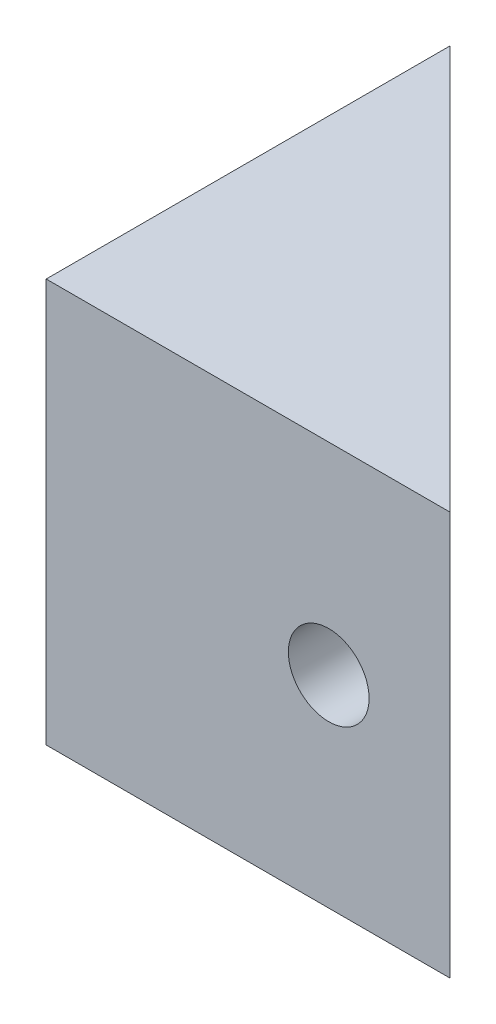
ISO-10303-21;
HEADER;
FILE_DESCRIPTION(('STEP AP214'),'2;1');
FILE_NAME('part.step','',(''),(''),'','','');
FILE_SCHEMA(('AUTOMOTIVE_DESIGN { 1 0 10303 214 1 1 1 1 }'));
ENDSEC;
DATA;
#1=APPLICATION_CONTEXT('core data for automotive mechanical design processes');
#2=APPLICATION_PROTOCOL_DEFINITION('international standard','automotive_design',2000,#1);
#3=PRODUCT_CONTEXT('',#1,'mechanical');
#4=PRODUCT('Part','Part','',(#3));
#5=PRODUCT_RELATED_PRODUCT_CATEGORY('part','',(#4));
#6=PRODUCT_DEFINITION_FORMATION('','',#4);
#7=PRODUCT_DEFINITION_CONTEXT('part definition',#1,'design');
#8=PRODUCT_DEFINITION('design','',#6,#7);
#9=PRODUCT_DEFINITION_SHAPE('','',#8);
#10=(LENGTH_UNIT() NAMED_UNIT(*) SI_UNIT(.MILLI.,.METRE.));
#11=(NAMED_UNIT(*) PLANE_ANGLE_UNIT() SI_UNIT($,.RADIAN.));
#12=(NAMED_UNIT(*) SI_UNIT($,.STERADIAN.) SOLID_ANGLE_UNIT());
#13=UNCERTAINTY_MEASURE_WITH_UNIT(LENGTH_MEASURE(1.E-05),#10,'distance_accuracy_value','');
#14=(GEOMETRIC_REPRESENTATION_CONTEXT(3) GLOBAL_UNCERTAINTY_ASSIGNED_CONTEXT((#13)) GLOBAL_UNIT_ASSIGNED_CONTEXT((#10,
#11,#12)) REPRESENTATION_CONTEXT('',''));
#15=CARTESIAN_POINT('',(0.,0.,0.));
#16=DIRECTION('',(0.,0.,1.));
#17=DIRECTION('',(1.,0.,0.));
#18=AXIS2_PLACEMENT_3D('',#15,#16,#17);
#19=CARTESIAN_POINT('',(20.,20.,0.));
#20=DIRECTION('',(-0.707106781186548,0.,0.707106781186548));
#21=DIRECTION('',(0.707106781186548,0.,0.707106781186548));
#22=AXIS2_PLACEMENT_3D('',#19,#20,#21);
#23=PLANE('',#22);
#24=CARTESIAN_POINT('',(6.,10.,-14.));
#25=DIRECTION('',(-0.707106781186548,0.,0.707106781186548));
#26=DIRECTION('',(-0.707106781186548,0.,-0.707106781186548));
#27=AXIS2_PLACEMENT_3D('',#24,#25,#26);
#28=ELLIPSE('',#27,2.8284271247462,2.00000000000001);
#29=CARTESIAN_POINT('',(4.,10.,-16.));
#30=VERTEX_POINT('',#29);
#31=EDGE_CURVE('E130',#30,#30,#28,.F.);
#32=ORIENTED_EDGE('',*,*,#31,.F.);
#33=EDGE_LOOP('',(#32));
#34=FACE_BOUND('',#33,.T.);
#35=CARTESIAN_POINT('',(14.,10.,-6.));
#36=DIRECTION('',(-0.707106781186548,0.,0.707106781186548));
#37=DIRECTION('',(0.707106781186548,0.,0.707106781186548));
#38=AXIS2_PLACEMENT_3D('',#35,#36,#37);
#39=ELLIPSE('',#38,2.8284271247462,2.00000000000001);
#40=CARTESIAN_POINT('',(16.,10.,-3.99999999999999));
#41=VERTEX_POINT('',#40);
#42=EDGE_CURVE('E93',#41,#41,#39,.T.);
#43=ORIENTED_EDGE('',*,*,#42,.T.);
#44=EDGE_LOOP('',(#43));
#45=FACE_BOUND('',#44,.T.);
#46=DIRECTION('',(-0.707106781186548,0.,-0.707106781186548));
#47=VECTOR('',#46,1.);
#48=CARTESIAN_POINT('',(20.,0.,0.));
#49=LINE('',#48,#47);
#50=CARTESIAN_POINT('',(20.,0.,0.));
#51=VERTEX_POINT('',#50);
#52=CARTESIAN_POINT('',(0.,0.,-20.));
#53=VERTEX_POINT('',#52);
#54=EDGE_CURVE('E89',#51,#53,#49,.T.);
#55=ORIENTED_EDGE('',*,*,#54,.T.);
#56=DIRECTION('',(0.,-1.,0.));
#57=VECTOR('',#56,1.);
#58=CARTESIAN_POINT('',(0.,20.,-20.));
#59=LINE('',#58,#57);
#60=CARTESIAN_POINT('',(0.,20.,-20.));
#61=VERTEX_POINT('',#60);
#62=EDGE_CURVE('E11',#61,#53,#59,.T.);
#63=ORIENTED_EDGE('',*,*,#62,.F.);
#64=DIRECTION('',(-0.707106781186548,0.,-0.707106781186548));
#65=VECTOR('',#64,1.);
#66=CARTESIAN_POINT('',(20.,20.,0.));
#67=LINE('',#66,#65);
#68=CARTESIAN_POINT('',(20.,20.,0.));
#69=VERTEX_POINT('',#68);
#70=EDGE_CURVE('E81',#69,#61,#67,.T.);
#71=ORIENTED_EDGE('',*,*,#70,.F.);
#72=DIRECTION('',(0.,-1.,0.));
#73=VECTOR('',#72,1.);
#74=CARTESIAN_POINT('',(20.,20.,0.));
#75=LINE('',#74,#73);
#76=EDGE_CURVE('E90',#69,#51,#75,.T.);
#77=ORIENTED_EDGE('',*,*,#76,.T.);
#78=EDGE_LOOP('',(#55,#63,#71,#77));
#79=FACE_BOUND('',#78,.T.);
#80=ADVANCED_FACE('F39',(#34,#45,#79),#23,.F.);
#81=CARTESIAN_POINT('',(0.,20.,-20.));
#82=DIRECTION('',(1.,0.,0.));
#83=DIRECTION('',(0.,0.,-1.));
#84=AXIS2_PLACEMENT_3D('',#81,#82,#83);
#85=PLANE('',#84);
#86=CARTESIAN_POINT('',(0.,10.,-14.));
#87=DIRECTION('',(1.,0.,0.));
#88=DIRECTION('',(0.,0.,-1.));
#89=AXIS2_PLACEMENT_3D('',#86,#87,#88);
#90=CIRCLE('',#89,2.00000000000001);
#91=CARTESIAN_POINT('',(0.,10.,-16.));
#92=VERTEX_POINT('',#91);
#93=EDGE_CURVE('E135',#92,#92,#90,.T.);
#94=ORIENTED_EDGE('',*,*,#93,.T.);
#95=EDGE_LOOP('',(#94));
#96=FACE_BOUND('',#95,.T.);
#97=DIRECTION('',(0.,0.,1.));
#98=VECTOR('',#97,1.);
#99=CARTESIAN_POINT('',(0.,0.,-20.));
#100=LINE('',#99,#98);
#101=CARTESIAN_POINT('',(0.,0.,0.));
#102=VERTEX_POINT('',#101);
#103=EDGE_CURVE('E68',#53,#102,#100,.T.);
#104=ORIENTED_EDGE('',*,*,#103,.T.);
#105=DIRECTION('',(0.,-1.,0.));
#106=VECTOR('',#105,1.);
#107=CARTESIAN_POINT('',(0.,20.,0.));
#108=LINE('',#107,#106);
#109=CARTESIAN_POINT('',(0.,20.,0.));
#110=VERTEX_POINT('',#109);
#111=EDGE_CURVE('E48',#110,#102,#108,.T.);
#112=ORIENTED_EDGE('',*,*,#111,.F.);
#113=DIRECTION('',(0.,0.,1.));
#114=VECTOR('',#113,1.);
#115=CARTESIAN_POINT('',(0.,20.,-20.));
#116=LINE('',#115,#114);
#117=EDGE_CURVE('E76',#61,#110,#116,.T.);
#118=ORIENTED_EDGE('',*,*,#117,.F.);
#119=ORIENTED_EDGE('',*,*,#62,.T.);
#120=EDGE_LOOP('',(#104,#112,#118,#119));
#121=FACE_BOUND('',#120,.T.);
#122=ADVANCED_FACE('F77',(#96,#121),#85,.F.);
#123=CARTESIAN_POINT('',(0.,20.,0.));
#124=DIRECTION('',(0.,0.,-1.));
#125=DIRECTION('',(-1.,0.,0.));
#126=AXIS2_PLACEMENT_3D('',#123,#124,#125);
#127=PLANE('',#126);
#128=CARTESIAN_POINT('',(14.,10.,0.));
#129=DIRECTION('',(0.,0.,1.));
#130=DIRECTION('',(1.,0.,0.));
#131=AXIS2_PLACEMENT_3D('',#128,#129,#130);
#132=CIRCLE('',#131,2.00000000000001);
#133=CARTESIAN_POINT('',(16.,10.,0.));
#134=VERTEX_POINT('',#133);
#135=EDGE_CURVE('E99',#134,#134,#132,.T.);
#136=ORIENTED_EDGE('',*,*,#135,.F.);
#137=EDGE_LOOP('',(#136));
#138=FACE_BOUND('',#137,.T.);
#139=DIRECTION('',(1.,0.,0.));
#140=VECTOR('',#139,1.);
#141=CARTESIAN_POINT('',(0.,0.,0.));
#142=LINE('',#141,#140);
#143=EDGE_CURVE('E73',#102,#51,#142,.T.);
#144=ORIENTED_EDGE('',*,*,#143,.T.);
#145=ORIENTED_EDGE('',*,*,#76,.F.);
#146=DIRECTION('',(1.,0.,0.));
#147=VECTOR('',#146,1.);
#148=CARTESIAN_POINT('',(0.,20.,0.));
#149=LINE('',#148,#147);
#150=EDGE_CURVE('E56',#110,#69,#149,.T.);
#151=ORIENTED_EDGE('',*,*,#150,.F.);
#152=ORIENTED_EDGE('',*,*,#111,.T.);
#153=EDGE_LOOP('',(#144,#145,#151,#152));
#154=FACE_BOUND('',#153,.T.);
#155=ADVANCED_FACE('F107',(#138,#154),#127,.F.);
#156=CARTESIAN_POINT('',(0.,20.,0.));
#157=DIRECTION('',(0.,1.,0.));
#158=DIRECTION('',(0.,0.,1.));
#159=AXIS2_PLACEMENT_3D('',#156,#157,#158);
#160=PLANE('',#159);
#161=ORIENTED_EDGE('',*,*,#70,.T.);
#162=ORIENTED_EDGE('',*,*,#117,.T.);
#163=ORIENTED_EDGE('',*,*,#150,.T.);
#164=EDGE_LOOP('',(#161,#162,#163));
#165=FACE_BOUND('',#164,.T.);
#166=ADVANCED_FACE('F84',(#165),#160,.T.);
#167=CARTESIAN_POINT('',(0.,0.,0.));
#168=DIRECTION('',(0.,1.,0.));
#169=DIRECTION('',(0.,0.,1.));
#170=AXIS2_PLACEMENT_3D('',#167,#168,#169);
#171=PLANE('',#170);
#172=ORIENTED_EDGE('',*,*,#54,.F.);
#173=ORIENTED_EDGE('',*,*,#143,.F.);
#174=ORIENTED_EDGE('',*,*,#103,.F.);
#175=EDGE_LOOP('',(#172,#173,#174));
#176=FACE_BOUND('',#175,.T.);
#177=ADVANCED_FACE('F108',(#176),#171,.F.);
#178=CARTESIAN_POINT('',(14.,10.,-20.));
#179=DIRECTION('',(0.,0.,1.));
#180=DIRECTION('',(1.,0.,0.));
#181=AXIS2_PLACEMENT_3D('',#178,#179,#180);
#182=CYLINDRICAL_SURFACE('',#181,2.00000000000001);
#183=ORIENTED_EDGE('',*,*,#135,.T.);
#184=EDGE_LOOP('',(#183));
#185=FACE_BOUND('',#184,.T.);
#186=ORIENTED_EDGE('',*,*,#42,.F.);
#187=EDGE_LOOP('',(#186));
#188=FACE_BOUND('',#187,.T.);
#189=ADVANCED_FACE('F110',(#185,#188),#182,.F.);
#190=CARTESIAN_POINT('',(20.,10.,-14.));
#191=DIRECTION('',(-1.,0.,0.));
#192=DIRECTION('',(0.,0.,1.));
#193=AXIS2_PLACEMENT_3D('',#190,#191,#192);
#194=CYLINDRICAL_SURFACE('',#193,2.00000000000001);
#195=ORIENTED_EDGE('',*,*,#93,.F.);
#196=EDGE_LOOP('',(#195));
#197=FACE_BOUND('',#196,.T.);
#198=ORIENTED_EDGE('',*,*,#31,.T.);
#199=EDGE_LOOP('',(#198));
#200=FACE_BOUND('',#199,.T.);
#201=ADVANCED_FACE('F116',(#197,#200),#194,.F.);
#202=CLOSED_SHELL('',(#80,#122,#155,#166,#177,#189,#201));
#203=MANIFOLD_SOLID_BREP('B2',#202);
#204=ADVANCED_BREP_SHAPE_REPRESENTATION('',(#18,#203),#14);
#205=SHAPE_DEFINITION_REPRESENTATION(#9,#204);
ENDSEC;
END-ISO-10303-21;
